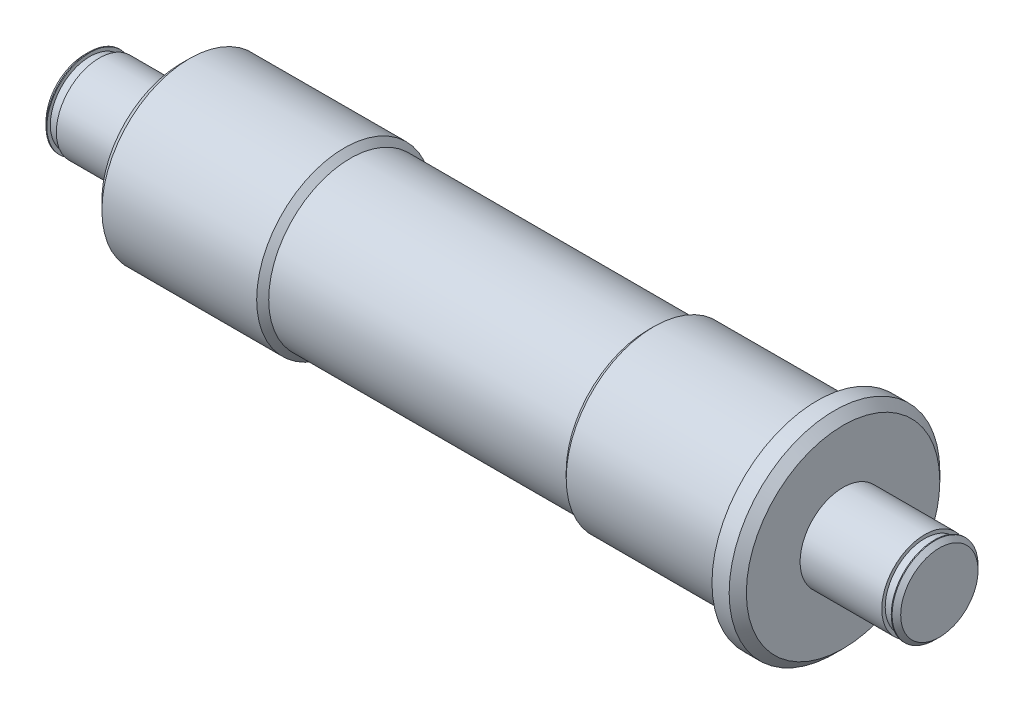
ISO-10303-21;
HEADER;
FILE_DESCRIPTION(('STEP AP214'),'2;1');
FILE_NAME('part.step','',(''),(''),'','','');
FILE_SCHEMA(('AUTOMOTIVE_DESIGN { 1 0 10303 214 1 1 1 1 }'));
ENDSEC;
DATA;
#1=APPLICATION_CONTEXT('core data for automotive mechanical design processes');
#2=APPLICATION_PROTOCOL_DEFINITION('international standard','automotive_design',2000,#1);
#3=PRODUCT_CONTEXT('',#1,'mechanical');
#4=PRODUCT('Part','Part','',(#3));
#5=PRODUCT_RELATED_PRODUCT_CATEGORY('part','',(#4));
#6=PRODUCT_DEFINITION_FORMATION('','',#4);
#7=PRODUCT_DEFINITION_CONTEXT('part definition',#1,'design');
#8=PRODUCT_DEFINITION('design','',#6,#7);
#9=PRODUCT_DEFINITION_SHAPE('','',#8);
#10=(LENGTH_UNIT() NAMED_UNIT(*) SI_UNIT(.MILLI.,.METRE.));
#11=(NAMED_UNIT(*) PLANE_ANGLE_UNIT() SI_UNIT($,.RADIAN.));
#12=(NAMED_UNIT(*) SI_UNIT($,.STERADIAN.) SOLID_ANGLE_UNIT());
#13=UNCERTAINTY_MEASURE_WITH_UNIT(LENGTH_MEASURE(1.E-05),#10,'distance_accuracy_value','');
#14=(GEOMETRIC_REPRESENTATION_CONTEXT(3) GLOBAL_UNCERTAINTY_ASSIGNED_CONTEXT((#13)) GLOBAL_UNIT_ASSIGNED_CONTEXT((#10,
#11,#12)) REPRESENTATION_CONTEXT('',''));
#15=CARTESIAN_POINT('',(0.,0.,0.));
#16=DIRECTION('',(0.,0.,1.));
#17=DIRECTION('',(1.,0.,0.));
#18=AXIS2_PLACEMENT_3D('',#15,#16,#17);
#19=CARTESIAN_POINT('',(0.,0.,0.));
#20=DIRECTION('',(1.,0.,0.));
#21=DIRECTION('',(0.,0.,-1.));
#22=AXIS2_PLACEMENT_3D('',#19,#20,#21);
#23=PLANE('',#22);
#24=CARTESIAN_POINT('',(0.,0.,0.));
#25=DIRECTION('',(1.,0.,0.));
#26=DIRECTION('',(0.,0.,-1.));
#27=AXIS2_PLACEMENT_3D('',#24,#25,#26);
#28=CIRCLE('',#27,4.50000000000002);
#29=CARTESIAN_POINT('',(0.,0.,-4.50000000000002));
#30=VERTEX_POINT('',#29);
#31=EDGE_CURVE('E62',#30,#30,#28,.F.);
#32=ORIENTED_EDGE('',*,*,#31,.T.);
#33=EDGE_LOOP('',(#32));
#34=FACE_BOUND('',#33,.T.);
#35=ADVANCED_FACE('F53',(#34),#23,.F.);
#36=CARTESIAN_POINT('',(-10.6746561027708,0.,0.));
#37=DIRECTION('',(-1.,0.,0.));
#38=DIRECTION('',(0.,0.,1.));
#39=AXIS2_PLACEMENT_3D('',#36,#37,#38);
#40=CYLINDRICAL_SURFACE('',#39,5.);
#41=CARTESIAN_POINT('',(0.499999999999987,0.,0.));
#42=DIRECTION('',(1.,0.,0.));
#43=DIRECTION('',(0.,0.,-1.));
#44=AXIS2_PLACEMENT_3D('',#41,#42,#43);
#45=CIRCLE('',#44,5.);
#46=CARTESIAN_POINT('',(0.499999999999987,0.,-5.));
#47=VERTEX_POINT('',#46);
#48=EDGE_CURVE('E12',#47,#47,#45,.T.);
#49=ORIENTED_EDGE('',*,*,#48,.T.);
#50=EDGE_LOOP('',(#49));
#51=FACE_BOUND('',#50,.T.);
#52=CARTESIAN_POINT('',(0.599999999999996,0.,0.));
#53=DIRECTION('',(-1.,0.,0.));
#54=DIRECTION('',(0.,0.,1.));
#55=AXIS2_PLACEMENT_3D('',#52,#53,#54);
#56=CIRCLE('',#55,5.);
#57=CARTESIAN_POINT('',(0.599999999999996,0.,5.));
#58=VERTEX_POINT('',#57);
#59=EDGE_CURVE('E112',#58,#58,#56,.T.);
#60=ORIENTED_EDGE('',*,*,#59,.T.);
#61=EDGE_LOOP('',(#60));
#62=FACE_BOUND('',#61,.T.);
#63=ADVANCED_FACE('F180',(#51,#62),#40,.T.);
#64=CARTESIAN_POINT('',(0.599999999999996,5.,0.));
#65=DIRECTION('',(-1.,0.,0.));
#66=DIRECTION('',(0.,0.,1.));
#67=AXIS2_PLACEMENT_3D('',#64,#65,#66);
#68=PLANE('',#67);
#69=ORIENTED_EDGE('',*,*,#59,.F.);
#70=EDGE_LOOP('',(#69));
#71=FACE_BOUND('',#70,.T.);
#72=CARTESIAN_POINT('',(0.599999999999996,0.,0.));
#73=DIRECTION('',(-1.,0.,0.));
#74=DIRECTION('',(0.,0.,1.));
#75=AXIS2_PLACEMENT_3D('',#72,#73,#74);
#76=CIRCLE('',#75,4.6);
#77=CARTESIAN_POINT('',(0.599999999999996,0.,4.6));
#78=VERTEX_POINT('',#77);
#79=EDGE_CURVE('E116',#78,#78,#76,.T.);
#80=ORIENTED_EDGE('',*,*,#79,.T.);
#81=EDGE_LOOP('',(#80));
#82=FACE_BOUND('',#81,.T.);
#83=ADVANCED_FACE('F185',(#71,#82),#68,.F.);
#84=CARTESIAN_POINT('',(-10.6746561027708,0.,0.));
#85=DIRECTION('',(-1.,0.,0.));
#86=DIRECTION('',(0.,0.,1.));
#87=AXIS2_PLACEMENT_3D('',#84,#85,#86);
#88=CYLINDRICAL_SURFACE('',#87,4.6);
#89=ORIENTED_EDGE('',*,*,#79,.F.);
#90=EDGE_LOOP('',(#89));
#91=FACE_BOUND('',#90,.T.);
#92=CARTESIAN_POINT('',(1.7,0.,0.));
#93=DIRECTION('',(-1.,0.,0.));
#94=DIRECTION('',(0.,0.,1.));
#95=AXIS2_PLACEMENT_3D('',#92,#93,#94);
#96=CIRCLE('',#95,4.6);
#97=CARTESIAN_POINT('',(1.7,0.,4.6));
#98=VERTEX_POINT('',#97);
#99=EDGE_CURVE('E120',#98,#98,#96,.T.);
#100=ORIENTED_EDGE('',*,*,#99,.T.);
#101=EDGE_LOOP('',(#100));
#102=FACE_BOUND('',#101,.T.);
#103=ADVANCED_FACE('F393',(#91,#102),#88,.T.);
#104=CARTESIAN_POINT('',(1.7,4.6,0.));
#105=DIRECTION('',(1.,0.,0.));
#106=DIRECTION('',(0.,0.,-1.));
#107=AXIS2_PLACEMENT_3D('',#104,#105,#106);
#108=PLANE('',#107);
#109=ORIENTED_EDGE('',*,*,#99,.F.);
#110=EDGE_LOOP('',(#109));
#111=FACE_BOUND('',#110,.T.);
#112=CARTESIAN_POINT('',(1.7,0.,0.));
#113=DIRECTION('',(-1.,0.,0.));
#114=DIRECTION('',(0.,0.,1.));
#115=AXIS2_PLACEMENT_3D('',#112,#113,#114);
#116=CIRCLE('',#115,5.);
#117=CARTESIAN_POINT('',(1.7,0.,5.));
#118=VERTEX_POINT('',#117);
#119=EDGE_CURVE('E124',#118,#118,#116,.T.);
#120=ORIENTED_EDGE('',*,*,#119,.T.);
#121=EDGE_LOOP('',(#120));
#122=FACE_BOUND('',#121,.T.);
#123=ADVANCED_FACE('F383',(#111,#122),#108,.F.);
#124=CARTESIAN_POINT('',(-10.6746561027708,0.,0.));
#125=DIRECTION('',(-1.,0.,0.));
#126=DIRECTION('',(0.,0.,1.));
#127=AXIS2_PLACEMENT_3D('',#124,#125,#126);
#128=CYLINDRICAL_SURFACE('',#127,5.);
#129=ORIENTED_EDGE('',*,*,#119,.F.);
#130=EDGE_LOOP('',(#129));
#131=FACE_BOUND('',#130,.T.);
#132=CARTESIAN_POINT('',(11.2,0.,0.));
#133=DIRECTION('',(-1.,0.,0.));
#134=DIRECTION('',(0.,0.,1.));
#135=AXIS2_PLACEMENT_3D('',#132,#133,#134);
#136=CIRCLE('',#135,5.);
#137=CARTESIAN_POINT('',(11.2,0.,5.));
#138=VERTEX_POINT('',#137);
#139=EDGE_CURVE('E128',#138,#138,#136,.T.);
#140=ORIENTED_EDGE('',*,*,#139,.T.);
#141=EDGE_LOOP('',(#140));
#142=FACE_BOUND('',#141,.T.);
#143=ADVANCED_FACE('F373',(#131,#142),#128,.T.);
#144=CARTESIAN_POINT('',(11.2,5.,0.));
#145=DIRECTION('',(1.,0.,0.));
#146=DIRECTION('',(0.,0.,-1.));
#147=AXIS2_PLACEMENT_3D('',#144,#145,#146);
#148=PLANE('',#147);
#149=CARTESIAN_POINT('',(11.2,0.,0.));
#150=DIRECTION('',(1.,0.,0.));
#151=DIRECTION('',(0.,0.,-1.));
#152=AXIS2_PLACEMENT_3D('',#149,#150,#151);
#153=CIRCLE('',#152,9.19999999999999);
#154=CARTESIAN_POINT('',(11.2,0.,-9.19999999999999));
#155=VERTEX_POINT('',#154);
#156=EDGE_CURVE('E88',#155,#155,#153,.F.);
#157=ORIENTED_EDGE('',*,*,#156,.T.);
#158=EDGE_LOOP('',(#157));
#159=FACE_BOUND('',#158,.T.);
#160=ORIENTED_EDGE('',*,*,#139,.F.);
#161=EDGE_LOOP('',(#160));
#162=FACE_BOUND('',#161,.T.);
#163=ADVANCED_FACE('F363',(#159,#162),#148,.F.);
#164=CARTESIAN_POINT('',(-10.6746561027708,0.,0.));
#165=DIRECTION('',(-1.,0.,0.));
#166=DIRECTION('',(0.,0.,1.));
#167=AXIS2_PLACEMENT_3D('',#164,#165,#166);
#168=CYLINDRICAL_SURFACE('',#167,10.2);
#169=CARTESIAN_POINT('',(30.2,0.,0.));
#170=DIRECTION('',(-1.,0.,0.));
#171=DIRECTION('',(0.,0.,1.));
#172=AXIS2_PLACEMENT_3D('',#169,#170,#171);
#173=CIRCLE('',#172,10.2);
#174=CARTESIAN_POINT('',(30.2,0.,10.2));
#175=VERTEX_POINT('',#174);
#176=EDGE_CURVE('E100',#175,#175,#173,.T.);
#177=ORIENTED_EDGE('',*,*,#176,.T.);
#178=EDGE_LOOP('',(#177));
#179=FACE_BOUND('',#178,.T.);
#180=CARTESIAN_POINT('',(12.2,0.,0.));
#181=DIRECTION('',(1.,0.,0.));
#182=DIRECTION('',(0.,0.,-1.));
#183=AXIS2_PLACEMENT_3D('',#180,#181,#182);
#184=CIRCLE('',#183,10.2);
#185=CARTESIAN_POINT('',(12.2,0.,-10.2));
#186=VERTEX_POINT('',#185);
#187=EDGE_CURVE('E104',#186,#186,#184,.T.);
#188=ORIENTED_EDGE('',*,*,#187,.T.);
#189=EDGE_LOOP('',(#188));
#190=FACE_BOUND('',#189,.T.);
#191=ADVANCED_FACE('F353',(#179,#190),#168,.T.);
#192=CARTESIAN_POINT('',(-10.6746561027708,0.,0.));
#193=DIRECTION('',(-1.,0.,0.));
#194=DIRECTION('',(0.,0.,1.));
#195=AXIS2_PLACEMENT_3D('',#192,#193,#194);
#196=CYLINDRICAL_SURFACE('',#195,9.5);
#197=CARTESIAN_POINT('',(30.9,0.,0.));
#198=DIRECTION('',(-1.,0.,0.));
#199=DIRECTION('',(0.,0.,1.));
#200=AXIS2_PLACEMENT_3D('',#197,#198,#199);
#201=CIRCLE('',#200,9.5);
#202=CARTESIAN_POINT('',(30.9,0.,9.5));
#203=VERTEX_POINT('',#202);
#204=EDGE_CURVE('E80',#203,#203,#201,.F.);
#205=ORIENTED_EDGE('',*,*,#204,.T.);
#206=EDGE_LOOP('',(#205));
#207=FACE_BOUND('',#206,.T.);
#208=CARTESIAN_POINT('',(65.5,0.,0.));
#209=DIRECTION('',(1.,0.,0.));
#210=DIRECTION('',(0.,0.,-1.));
#211=AXIS2_PLACEMENT_3D('',#208,#209,#210);
#212=CIRCLE('',#211,9.5);
#213=CARTESIAN_POINT('',(65.5,0.,-9.5));
#214=VERTEX_POINT('',#213);
#215=EDGE_CURVE('E84',#214,#214,#212,.F.);
#216=ORIENTED_EDGE('',*,*,#215,.T.);
#217=EDGE_LOOP('',(#216));
#218=FACE_BOUND('',#217,.T.);
#219=ADVANCED_FACE('F343',(#207,#218),#196,.T.);
#220=CARTESIAN_POINT('',(-10.6746561027708,0.,0.));
#221=DIRECTION('',(-1.,0.,0.));
#222=DIRECTION('',(0.,0.,1.));
#223=AXIS2_PLACEMENT_3D('',#220,#221,#222);
#224=CYLINDRICAL_SURFACE('',#223,10.2);
#225=CARTESIAN_POINT('',(66.2,0.,0.));
#226=DIRECTION('',(1.,0.,0.));
#227=DIRECTION('',(0.,0.,-1.));
#228=AXIS2_PLACEMENT_3D('',#225,#226,#227);
#229=CIRCLE('',#228,10.2);
#230=CARTESIAN_POINT('',(66.2,0.,-10.2));
#231=VERTEX_POINT('',#230);
#232=EDGE_CURVE('E108',#231,#231,#229,.T.);
#233=ORIENTED_EDGE('',*,*,#232,.T.);
#234=EDGE_LOOP('',(#233));
#235=FACE_BOUND('',#234,.T.);
#236=CARTESIAN_POINT('',(85.2,0.,0.));
#237=DIRECTION('',(-1.,0.,0.));
#238=DIRECTION('',(0.,0.,1.));
#239=AXIS2_PLACEMENT_3D('',#236,#237,#238);
#240=CIRCLE('',#239,10.2);
#241=CARTESIAN_POINT('',(85.2,0.,10.2));
#242=VERTEX_POINT('',#241);
#243=EDGE_CURVE('E132',#242,#242,#240,.T.);
#244=ORIENTED_EDGE('',*,*,#243,.T.);
#245=EDGE_LOOP('',(#244));
#246=FACE_BOUND('',#245,.T.);
#247=ADVANCED_FACE('F333',(#235,#246),#224,.T.);
#248=CARTESIAN_POINT('',(85.2,10.2,0.));
#249=DIRECTION('',(1.,0.,0.));
#250=DIRECTION('',(0.,0.,-1.));
#251=AXIS2_PLACEMENT_3D('',#248,#249,#250);
#252=PLANE('',#251);
#253=ORIENTED_EDGE('',*,*,#243,.F.);
#254=EDGE_LOOP('',(#253));
#255=FACE_BOUND('',#254,.T.);
#256=CARTESIAN_POINT('',(85.2,0.,0.));
#257=DIRECTION('',(-1.,0.,0.));
#258=DIRECTION('',(0.,0.,1.));
#259=AXIS2_PLACEMENT_3D('',#256,#257,#258);
#260=CIRCLE('',#259,12.25);
#261=CARTESIAN_POINT('',(85.2,0.,12.25));
#262=VERTEX_POINT('',#261);
#263=EDGE_CURVE('E136',#262,#262,#260,.T.);
#264=ORIENTED_EDGE('',*,*,#263,.T.);
#265=EDGE_LOOP('',(#264));
#266=FACE_BOUND('',#265,.T.);
#267=ADVANCED_FACE('F323',(#255,#266),#252,.F.);
#268=CARTESIAN_POINT('',(-10.6746561027708,0.,0.));
#269=DIRECTION('',(-1.,0.,0.));
#270=DIRECTION('',(0.,0.,1.));
#271=AXIS2_PLACEMENT_3D('',#268,#269,#270);
#272=CYLINDRICAL_SURFACE('',#271,12.25);
#273=CARTESIAN_POINT('',(87.2,0.,0.));
#274=DIRECTION('',(-1.,0.,0.));
#275=DIRECTION('',(0.,0.,1.));
#276=AXIS2_PLACEMENT_3D('',#273,#274,#275);
#277=CIRCLE('',#276,12.25);
#278=CARTESIAN_POINT('',(87.2,0.,12.25));
#279=VERTEX_POINT('',#278);
#280=EDGE_CURVE('E96',#279,#279,#277,.T.);
#281=ORIENTED_EDGE('',*,*,#280,.T.);
#282=EDGE_LOOP('',(#281));
#283=FACE_BOUND('',#282,.T.);
#284=ORIENTED_EDGE('',*,*,#263,.F.);
#285=EDGE_LOOP('',(#284));
#286=FACE_BOUND('',#285,.T.);
#287=ADVANCED_FACE('F313',(#283,#286),#272,.T.);
#288=CARTESIAN_POINT('',(88.2,12.25,0.));
#289=DIRECTION('',(-1.,0.,0.));
#290=DIRECTION('',(0.,0.,1.));
#291=AXIS2_PLACEMENT_3D('',#288,#289,#290);
#292=PLANE('',#291);
#293=CARTESIAN_POINT('',(88.2,0.,0.));
#294=DIRECTION('',(-1.,0.,0.));
#295=DIRECTION('',(0.,0.,1.));
#296=AXIS2_PLACEMENT_3D('',#293,#294,#295);
#297=CIRCLE('',#296,11.25);
#298=CARTESIAN_POINT('',(88.2,0.,11.25));
#299=VERTEX_POINT('',#298);
#300=EDGE_CURVE('E92',#299,#299,#297,.F.);
#301=ORIENTED_EDGE('',*,*,#300,.T.);
#302=EDGE_LOOP('',(#301));
#303=FACE_BOUND('',#302,.T.);
#304=CARTESIAN_POINT('',(88.2,0.,0.));
#305=DIRECTION('',(-1.,0.,0.));
#306=DIRECTION('',(0.,0.,1.));
#307=AXIS2_PLACEMENT_3D('',#304,#305,#306);
#308=CIRCLE('',#307,5.);
#309=CARTESIAN_POINT('',(88.2,0.,5.));
#310=VERTEX_POINT('',#309);
#311=EDGE_CURVE('E140',#310,#310,#308,.T.);
#312=ORIENTED_EDGE('',*,*,#311,.T.);
#313=EDGE_LOOP('',(#312));
#314=FACE_BOUND('',#313,.T.);
#315=ADVANCED_FACE('F305',(#303,#314),#292,.F.);
#316=CARTESIAN_POINT('',(-10.6746561027708,0.,0.));
#317=DIRECTION('',(-1.,0.,0.));
#318=DIRECTION('',(0.,0.,1.));
#319=AXIS2_PLACEMENT_3D('',#316,#317,#318);
#320=CYLINDRICAL_SURFACE('',#319,5.);
#321=ORIENTED_EDGE('',*,*,#311,.F.);
#322=EDGE_LOOP('',(#321));
#323=FACE_BOUND('',#322,.T.);
#324=CARTESIAN_POINT('',(97.7,0.,0.));
#325=DIRECTION('',(-1.,0.,0.));
#326=DIRECTION('',(0.,0.,1.));
#327=AXIS2_PLACEMENT_3D('',#324,#325,#326);
#328=CIRCLE('',#327,5.);
#329=CARTESIAN_POINT('',(97.7,0.,5.));
#330=VERTEX_POINT('',#329);
#331=EDGE_CURVE('E144',#330,#330,#328,.T.);
#332=ORIENTED_EDGE('',*,*,#331,.T.);
#333=EDGE_LOOP('',(#332));
#334=FACE_BOUND('',#333,.T.);
#335=ADVANCED_FACE('F294',(#323,#334),#320,.T.);
#336=CARTESIAN_POINT('',(97.7,5.,0.));
#337=DIRECTION('',(-1.,0.,0.));
#338=DIRECTION('',(0.,0.,1.));
#339=AXIS2_PLACEMENT_3D('',#336,#337,#338);
#340=PLANE('',#339);
#341=ORIENTED_EDGE('',*,*,#331,.F.);
#342=EDGE_LOOP('',(#341));
#343=FACE_BOUND('',#342,.T.);
#344=CARTESIAN_POINT('',(97.7,0.,0.));
#345=DIRECTION('',(-1.,0.,0.));
#346=DIRECTION('',(0.,0.,1.));
#347=AXIS2_PLACEMENT_3D('',#344,#345,#346);
#348=CIRCLE('',#347,4.6);
#349=CARTESIAN_POINT('',(97.7,0.,4.6));
#350=VERTEX_POINT('',#349);
#351=EDGE_CURVE('E148',#350,#350,#348,.T.);
#352=ORIENTED_EDGE('',*,*,#351,.T.);
#353=EDGE_LOOP('',(#352));
#354=FACE_BOUND('',#353,.T.);
#355=ADVANCED_FACE('F284',(#343,#354),#340,.F.);
#356=CARTESIAN_POINT('',(-10.6746561027708,0.,0.));
#357=DIRECTION('',(-1.,0.,0.));
#358=DIRECTION('',(0.,0.,1.));
#359=AXIS2_PLACEMENT_3D('',#356,#357,#358);
#360=CYLINDRICAL_SURFACE('',#359,4.6);
#361=ORIENTED_EDGE('',*,*,#351,.F.);
#362=EDGE_LOOP('',(#361));
#363=FACE_BOUND('',#362,.T.);
#364=CARTESIAN_POINT('',(98.8,0.,0.));
#365=DIRECTION('',(-1.,0.,0.));
#366=DIRECTION('',(0.,0.,1.));
#367=AXIS2_PLACEMENT_3D('',#364,#365,#366);
#368=CIRCLE('',#367,4.6);
#369=CARTESIAN_POINT('',(98.8,0.,4.6));
#370=VERTEX_POINT('',#369);
#371=EDGE_CURVE('E152',#370,#370,#368,.T.);
#372=ORIENTED_EDGE('',*,*,#371,.T.);
#373=EDGE_LOOP('',(#372));
#374=FACE_BOUND('',#373,.T.);
#375=ADVANCED_FACE('F176',(#363,#374),#360,.T.);
#376=CARTESIAN_POINT('',(98.8,4.6,0.));
#377=DIRECTION('',(1.,0.,0.));
#378=DIRECTION('',(0.,0.,-1.));
#379=AXIS2_PLACEMENT_3D('',#376,#377,#378);
#380=PLANE('',#379);
#381=ORIENTED_EDGE('',*,*,#371,.F.);
#382=EDGE_LOOP('',(#381));
#383=FACE_BOUND('',#382,.T.);
#384=CARTESIAN_POINT('',(98.8,0.,0.));
#385=DIRECTION('',(-1.,0.,0.));
#386=DIRECTION('',(0.,0.,1.));
#387=AXIS2_PLACEMENT_3D('',#384,#385,#386);
#388=CIRCLE('',#387,5.);
#389=CARTESIAN_POINT('',(98.8,0.,5.));
#390=VERTEX_POINT('',#389);
#391=EDGE_CURVE('E156',#390,#390,#388,.T.);
#392=ORIENTED_EDGE('',*,*,#391,.T.);
#393=EDGE_LOOP('',(#392));
#394=FACE_BOUND('',#393,.T.);
#395=ADVANCED_FACE('F162',(#383,#394),#380,.F.);
#396=CARTESIAN_POINT('',(-10.6746561027708,0.,0.));
#397=DIRECTION('',(-1.,0.,0.));
#398=DIRECTION('',(0.,0.,1.));
#399=AXIS2_PLACEMENT_3D('',#396,#397,#398);
#400=CYLINDRICAL_SURFACE('',#399,5.);
#401=CARTESIAN_POINT('',(98.9,0.,0.));
#402=DIRECTION('',(-1.,0.,0.));
#403=DIRECTION('',(0.,0.,1.));
#404=AXIS2_PLACEMENT_3D('',#401,#402,#403);
#405=CIRCLE('',#404,5.);
#406=CARTESIAN_POINT('',(98.9,0.,5.));
#407=VERTEX_POINT('',#406);
#408=EDGE_CURVE('E74',#407,#407,#405,.T.);
#409=ORIENTED_EDGE('',*,*,#408,.T.);
#410=EDGE_LOOP('',(#409));
#411=FACE_BOUND('',#410,.T.);
#412=ORIENTED_EDGE('',*,*,#391,.F.);
#413=EDGE_LOOP('',(#412));
#414=FACE_BOUND('',#413,.T.);
#415=ADVANCED_FACE('F164',(#411,#414),#400,.T.);
#416=CARTESIAN_POINT('',(99.4,5.,0.));
#417=DIRECTION('',(-1.,0.,0.));
#418=DIRECTION('',(0.,0.,1.));
#419=AXIS2_PLACEMENT_3D('',#416,#417,#418);
#420=PLANE('',#419);
#421=CARTESIAN_POINT('',(99.4,0.,0.));
#422=DIRECTION('',(-1.,0.,0.));
#423=DIRECTION('',(0.,0.,1.));
#424=AXIS2_PLACEMENT_3D('',#421,#422,#423);
#425=CIRCLE('',#424,4.50000000000002);
#426=CARTESIAN_POINT('',(99.4,0.,4.50000000000002));
#427=VERTEX_POINT('',#426);
#428=EDGE_CURVE('E68',#427,#427,#425,.F.);
#429=ORIENTED_EDGE('',*,*,#428,.T.);
#430=EDGE_LOOP('',(#429));
#431=FACE_BOUND('',#430,.T.);
#432=ADVANCED_FACE('F166',(#431),#420,.F.);
#433=CARTESIAN_POINT('',(65.2,0.,0.));
#434=DIRECTION('',(1.,0.,0.));
#435=DIRECTION('',(0.,0.,-1.));
#436=AXIS2_PLACEMENT_3D('',#433,#434,#435);
#437=CONICAL_SURFACE('',#436,9.19999999999998,0.785398163397457);
#438=ORIENTED_EDGE('',*,*,#232,.F.);
#439=EDGE_LOOP('',(#438));
#440=FACE_BOUND('',#439,.T.);
#441=ORIENTED_EDGE('',*,*,#215,.F.);
#442=EDGE_LOOP('',(#441));
#443=FACE_BOUND('',#442,.T.);
#444=ADVANCED_FACE('F173',(#440,#443),#437,.T.);
#445=CARTESIAN_POINT('',(30.2,0.,0.));
#446=DIRECTION('',(-1.,0.,0.));
#447=DIRECTION('',(0.,0.,1.));
#448=AXIS2_PLACEMENT_3D('',#445,#446,#447);
#449=CONICAL_SURFACE('',#448,10.2,0.785398163397445);
#450=ORIENTED_EDGE('',*,*,#204,.F.);
#451=EDGE_LOOP('',(#450));
#452=FACE_BOUND('',#451,.T.);
#453=ORIENTED_EDGE('',*,*,#176,.F.);
#454=EDGE_LOOP('',(#453));
#455=FACE_BOUND('',#454,.T.);
#456=ADVANCED_FACE('F195',(#452,#455),#449,.T.);
#457=CARTESIAN_POINT('',(87.2,0.,0.));
#458=DIRECTION('',(-1.,0.,0.));
#459=DIRECTION('',(0.,0.,1.));
#460=AXIS2_PLACEMENT_3D('',#457,#458,#459);
#461=CONICAL_SURFACE('',#460,12.25,0.785398163397443);
#462=ORIENTED_EDGE('',*,*,#300,.F.);
#463=EDGE_LOOP('',(#462));
#464=FACE_BOUND('',#463,.T.);
#465=ORIENTED_EDGE('',*,*,#280,.F.);
#466=EDGE_LOOP('',(#465));
#467=FACE_BOUND('',#466,.T.);
#468=ADVANCED_FACE('F202',(#464,#467),#461,.T.);
#469=CARTESIAN_POINT('',(11.2,0.,0.));
#470=DIRECTION('',(1.,0.,0.));
#471=DIRECTION('',(0.,0.,-1.));
#472=AXIS2_PLACEMENT_3D('',#469,#470,#471);
#473=CONICAL_SURFACE('',#472,9.19999999999999,0.785398163397443);
#474=ORIENTED_EDGE('',*,*,#187,.F.);
#475=EDGE_LOOP('',(#474));
#476=FACE_BOUND('',#475,.T.);
#477=ORIENTED_EDGE('',*,*,#156,.F.);
#478=EDGE_LOOP('',(#477));
#479=FACE_BOUND('',#478,.T.);
#480=ADVANCED_FACE('F209',(#476,#479),#473,.T.);
#481=CARTESIAN_POINT('',(98.9,0.,0.));
#482=DIRECTION('',(-1.,0.,0.));
#483=DIRECTION('',(0.,0.,1.));
#484=AXIS2_PLACEMENT_3D('',#481,#482,#483);
#485=CONICAL_SURFACE('',#484,5.,0.785398163397458);
#486=ORIENTED_EDGE('',*,*,#428,.F.);
#487=EDGE_LOOP('',(#486));
#488=FACE_BOUND('',#487,.T.);
#489=ORIENTED_EDGE('',*,*,#408,.F.);
#490=EDGE_LOOP('',(#489));
#491=FACE_BOUND('',#490,.T.);
#492=ADVANCED_FACE('F215',(#488,#491),#485,.T.);
#493=CARTESIAN_POINT('',(0.,0.,0.));
#494=DIRECTION('',(1.,0.,0.));
#495=DIRECTION('',(0.,0.,-1.));
#496=AXIS2_PLACEMENT_3D('',#493,#494,#495);
#497=CONICAL_SURFACE('',#496,4.50000000000002,0.785398163397444);
#498=ORIENTED_EDGE('',*,*,#48,.F.);
#499=EDGE_LOOP('',(#498));
#500=FACE_BOUND('',#499,.T.);
#501=ORIENTED_EDGE('',*,*,#31,.F.);
#502=EDGE_LOOP('',(#501));
#503=FACE_BOUND('',#502,.T.);
#504=ADVANCED_FACE('F56',(#500,#503),#497,.T.);
#505=CLOSED_SHELL('',(#35,#63,#83,#103,#123,#143,#163,#191,#219,#247,#267,#287,#315,#335,#355,
#375,#395,#415,#432,#444,#456,#468,#480,#492,#504));
#506=MANIFOLD_SOLID_BREP('B2',#505);
#507=ADVANCED_BREP_SHAPE_REPRESENTATION('',(#18,#506),#14);
#508=SHAPE_DEFINITION_REPRESENTATION(#9,#507);
ENDSEC;
END-ISO-10303-21;
